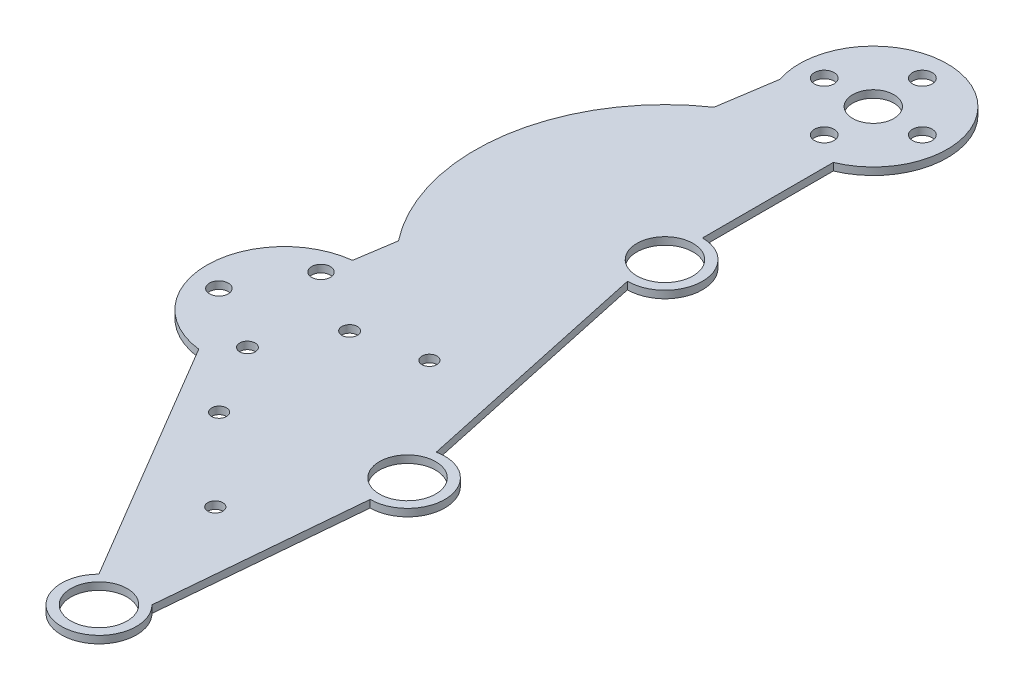
ISO-10303-21;
HEADER;
FILE_DESCRIPTION(('STEP AP214'),'2;1');
FILE_NAME('part.step','',(''),(''),'','','');
FILE_SCHEMA(('AUTOMOTIVE_DESIGN { 1 0 10303 214 1 1 1 1 }'));
ENDSEC;
DATA;
#1=APPLICATION_CONTEXT('core data for automotive mechanical design processes');
#2=APPLICATION_PROTOCOL_DEFINITION('international standard','automotive_design',2000,#1);
#3=PRODUCT_CONTEXT('',#1,'mechanical');
#4=PRODUCT('Part','Part','',(#3));
#5=PRODUCT_RELATED_PRODUCT_CATEGORY('part','',(#4));
#6=PRODUCT_DEFINITION_FORMATION('','',#4);
#7=PRODUCT_DEFINITION_CONTEXT('part definition',#1,'design');
#8=PRODUCT_DEFINITION('design','',#6,#7);
#9=PRODUCT_DEFINITION_SHAPE('','',#8);
#10=(LENGTH_UNIT() NAMED_UNIT(*) SI_UNIT(.MILLI.,.METRE.));
#11=(NAMED_UNIT(*) PLANE_ANGLE_UNIT() SI_UNIT($,.RADIAN.));
#12=(NAMED_UNIT(*) SI_UNIT($,.STERADIAN.) SOLID_ANGLE_UNIT());
#13=UNCERTAINTY_MEASURE_WITH_UNIT(LENGTH_MEASURE(1.E-05),#10,'distance_accuracy_value','');
#14=(GEOMETRIC_REPRESENTATION_CONTEXT(3) GLOBAL_UNCERTAINTY_ASSIGNED_CONTEXT((#13)) GLOBAL_UNIT_ASSIGNED_CONTEXT((#10,
#11,#12)) REPRESENTATION_CONTEXT('',''));
#15=CARTESIAN_POINT('',(0.,0.,0.));
#16=DIRECTION('',(0.,0.,1.));
#17=DIRECTION('',(1.,0.,0.));
#18=AXIS2_PLACEMENT_3D('',#15,#16,#17);
#19=CARTESIAN_POINT('',(46.6070895687635,1.5875,-56.1690373910345));
#20=DIRECTION('',(0.,-1.,0.));
#21=DIRECTION('',(0.,0.,-1.));
#22=AXIS2_PLACEMENT_3D('',#19,#20,#21);
#23=CYLINDRICAL_SURFACE('',#22,40.5);
#24=DIRECTION('',(0.,1.,0.));
#25=VECTOR('',#24,1.);
#26=CARTESIAN_POINT('',(14.718034312237,0.,-31.202296417367));
#27=LINE('',#26,#25);
#28=CARTESIAN_POINT('',(14.7180343122371,0.,-31.202296417367));
#29=VERTEX_POINT('',#28);
#30=CARTESIAN_POINT('',(14.7180343122371,1.5875,-31.202296417367));
#31=VERTEX_POINT('',#30);
#32=EDGE_CURVE('E50',#29,#31,#27,.T.);
#33=ORIENTED_EDGE('',*,*,#32,.T.);
#34=CARTESIAN_POINT('',(46.6070895687635,1.5875,-56.1690373910345));
#35=DIRECTION('',(0.,1.,0.));
#36=DIRECTION('',(0.,0.,1.));
#37=AXIS2_PLACEMENT_3D('',#34,#35,#36);
#38=CIRCLE('',#37,40.5);
#39=CARTESIAN_POINT('',(23.6849575190919,1.5875,-89.5580454969578));
#40=VERTEX_POINT('',#39);
#41=EDGE_CURVE('E188',#40,#31,#38,.T.);
#42=ORIENTED_EDGE('',*,*,#41,.F.);
#43=DIRECTION('',(0.,1.,0.));
#44=VECTOR('',#43,1.);
#45=CARTESIAN_POINT('',(23.6849575190919,0.,-89.5580454969578));
#46=LINE('',#45,#44);
#47=CARTESIAN_POINT('',(23.6849575190919,0.,-89.5580454969578));
#48=VERTEX_POINT('',#47);
#49=EDGE_CURVE('E139',#48,#40,#46,.T.);
#50=ORIENTED_EDGE('',*,*,#49,.F.);
#51=CARTESIAN_POINT('',(46.6070895687635,0.,-56.1690373910345));
#52=DIRECTION('',(0.,1.,0.));
#53=DIRECTION('',(0.,0.,1.));
#54=AXIS2_PLACEMENT_3D('',#51,#52,#53);
#55=CIRCLE('',#54,40.5);
#56=EDGE_CURVE('E55',#48,#29,#55,.T.);
#57=ORIENTED_EDGE('',*,*,#56,.T.);
#58=EDGE_LOOP('',(#33,#42,#50,#57));
#59=FACE_BOUND('',#58,.T.);
#60=ADVANCED_FACE('F35',(#59),#23,.T.);
#61=CARTESIAN_POINT('',(15.2467560354123,1.5875,-6.3076485631824));
#62=DIRECTION('',(0.,-1.,0.));
#63=DIRECTION('',(0.,0.,-1.));
#64=AXIS2_PLACEMENT_3D('',#61,#62,#63);
#65=CYLINDRICAL_SURFACE('',#64,16.5);
#66=CARTESIAN_POINT('',(15.2467560354123,0.,-6.3076485631824));
#67=DIRECTION('',(0.,1.,0.));
#68=DIRECTION('',(0.,0.,1.));
#69=AXIS2_PLACEMENT_3D('',#66,#67,#68);
#70=CIRCLE('',#69,16.5);
#71=CARTESIAN_POINT('',(13.4123990582158,0.,-22.7053659189673));
#72=VERTEX_POINT('',#71);
#73=CARTESIAN_POINT('',(13.4123990582158,0.,10.0900687926025));
#74=VERTEX_POINT('',#73);
#75=EDGE_CURVE('E124',#72,#74,#70,.T.);
#76=ORIENTED_EDGE('',*,*,#75,.T.);
#77=DIRECTION('',(0.,-1.,0.));
#78=VECTOR('',#77,1.);
#79=CARTESIAN_POINT('',(13.4123990582158,1.5875,10.0900687926025));
#80=LINE('',#79,#78);
#81=CARTESIAN_POINT('',(13.4123990582158,1.5875,10.0900687926025));
#82=VERTEX_POINT('',#81);
#83=EDGE_CURVE('E43',#82,#74,#80,.T.);
#84=ORIENTED_EDGE('',*,*,#83,.F.);
#85=CARTESIAN_POINT('',(15.2467560354123,1.5875,-6.3076485631824));
#86=DIRECTION('',(0.,1.,0.));
#87=DIRECTION('',(0.,0.,1.));
#88=AXIS2_PLACEMENT_3D('',#85,#86,#87);
#89=CIRCLE('',#88,16.5);
#90=CARTESIAN_POINT('',(13.4123990582158,1.5875,-22.7053659189673));
#91=VERTEX_POINT('',#90);
#92=EDGE_CURVE('E126',#91,#82,#89,.T.);
#93=ORIENTED_EDGE('',*,*,#92,.F.);
#94=DIRECTION('',(0.,-1.,0.));
#95=VECTOR('',#94,1.);
#96=CARTESIAN_POINT('',(13.4123990582158,1.5875,-22.7053659189673));
#97=LINE('',#96,#95);
#98=EDGE_CURVE('E11',#91,#72,#97,.T.);
#99=ORIENTED_EDGE('',*,*,#98,.T.);
#100=EDGE_LOOP('',(#76,#84,#93,#99));
#101=FACE_BOUND('',#100,.T.);
#102=ADVANCED_FACE('F37',(#101),#65,.T.);
#103=CARTESIAN_POINT('',(5.50767378532565,1.5875,-3.26092853556648));
#104=DIRECTION('',(-0.860488683472066,0.,0.509469553179099));
#105=DIRECTION('',(0.509469553179099,0.,0.860488683472066));
#106=AXIS2_PLACEMENT_3D('',#103,#104,#105);
#107=PLANE('',#106);
#108=DIRECTION('',(-0.509469553179099,0.,-0.860488683472066));
#109=VECTOR('',#108,1.);
#110=CARTESIAN_POINT('',(5.50767378532565,0.,-3.26092853556648));
#111=LINE('',#110,#109);
#112=CARTESIAN_POINT('',(44.3338284604601,0.,62.3160358035458));
#113=VERTEX_POINT('',#112);
#114=EDGE_CURVE('E138',#113,#74,#111,.T.);
#115=ORIENTED_EDGE('',*,*,#114,.F.);
#116=DIRECTION('',(0.,-1.,0.));
#117=VECTOR('',#116,1.);
#118=CARTESIAN_POINT('',(44.3338284604601,1.5875,62.3160358035458));
#119=LINE('',#118,#117);
#120=CARTESIAN_POINT('',(44.3338284604601,1.5875,62.3160358035458));
#121=VERTEX_POINT('',#120);
#122=EDGE_CURVE('E279',#121,#113,#119,.T.);
#123=ORIENTED_EDGE('',*,*,#122,.F.);
#124=DIRECTION('',(-0.509469553179099,0.,-0.860488683472066));
#125=VECTOR('',#124,1.);
#126=CARTESIAN_POINT('',(5.50767378532565,1.5875,-3.26092853556648));
#127=LINE('',#126,#125);
#128=EDGE_CURVE('E169',#121,#82,#127,.T.);
#129=ORIENTED_EDGE('',*,*,#128,.T.);
#130=ORIENTED_EDGE('',*,*,#83,.T.);
#131=EDGE_LOOP('',(#115,#123,#129,#130));
#132=FACE_BOUND('',#131,.T.);
#133=ADVANCED_FACE('F281',(#132),#107,.T.);
#134=CARTESIAN_POINT('',(50.,1.5875,67.9635573913317));
#135=DIRECTION('',(0.,-1.,0.));
#136=DIRECTION('',(0.,0.,-1.));
#137=AXIS2_PLACEMENT_3D('',#134,#135,#136);
#138=CYLINDRICAL_SURFACE('',#137,8.);
#139=CARTESIAN_POINT('',(50.,0.,67.9635573913317));
#140=DIRECTION('',(0.,1.,0.));
#141=DIRECTION('',(0.,0.,1.));
#142=AXIS2_PLACEMENT_3D('',#139,#140,#141);
#143=CIRCLE('',#142,8.);
#144=CARTESIAN_POINT('',(55.6661715395399,0.,62.3160358035458));
#145=VERTEX_POINT('',#144);
#146=EDGE_CURVE('E222',#113,#145,#143,.T.);
#147=ORIENTED_EDGE('',*,*,#146,.T.);
#148=DIRECTION('',(0.,-1.,0.));
#149=VECTOR('',#148,1.);
#150=CARTESIAN_POINT('',(55.6661715395399,1.5875,62.3160358035458));
#151=LINE('',#150,#149);
#152=CARTESIAN_POINT('',(55.6661715395399,1.5875,62.3160358035458));
#153=VERTEX_POINT('',#152);
#154=EDGE_CURVE('E277',#153,#145,#151,.T.);
#155=ORIENTED_EDGE('',*,*,#154,.F.);
#156=CARTESIAN_POINT('',(50.,1.5875,67.9635573913317));
#157=DIRECTION('',(0.,1.,0.));
#158=DIRECTION('',(0.,0.,1.));
#159=AXIS2_PLACEMENT_3D('',#156,#157,#158);
#160=CIRCLE('',#159,8.);
#161=EDGE_CURVE('E173',#121,#153,#160,.T.);
#162=ORIENTED_EDGE('',*,*,#161,.F.);
#163=ORIENTED_EDGE('',*,*,#122,.T.);
#164=EDGE_LOOP('',(#147,#155,#162,#163));
#165=FACE_BOUND('',#164,.T.);
#166=ADVANCED_FACE('F319',(#165),#138,.T.);
#167=CARTESIAN_POINT('',(60.7229238506235,1.5875,5.3944526583946));
#168=DIRECTION('',(0.996077182757255,0.,0.0884886771873701));
#169=DIRECTION('',(0.0884886771873701,0.,-0.996077182757255));
#170=AXIS2_PLACEMENT_3D('',#167,#168,#169);
#171=PLANE('',#170);
#172=DIRECTION('',(-0.0884886771873701,0.,0.996077182757255));
#173=VECTOR('',#172,1.);
#174=CARTESIAN_POINT('',(60.7229238506235,0.,5.3944526583946));
#175=LINE('',#174,#173);
#176=CARTESIAN_POINT('',(59.4628165552063,0.,19.5789129157589));
#177=VERTEX_POINT('',#176);
#178=EDGE_CURVE('E225',#177,#145,#175,.T.);
#179=ORIENTED_EDGE('',*,*,#178,.F.);
#180=DIRECTION('',(0.,-1.,0.));
#181=VECTOR('',#180,1.);
#182=CARTESIAN_POINT('',(59.4628165552063,1.5875,19.5789129157589));
#183=LINE('',#182,#181);
#184=CARTESIAN_POINT('',(59.4628165552063,1.5875,19.5789129157589));
#185=VERTEX_POINT('',#184);
#186=EDGE_CURVE('E275',#185,#177,#183,.T.);
#187=ORIENTED_EDGE('',*,*,#186,.F.);
#188=DIRECTION('',(-0.0884886771873701,0.,0.996077182757255));
#189=VECTOR('',#188,1.);
#190=CARTESIAN_POINT('',(60.7229238506235,1.5875,5.3944526583946));
#191=LINE('',#190,#189);
#192=EDGE_CURVE('E175',#185,#153,#191,.T.);
#193=ORIENTED_EDGE('',*,*,#192,.T.);
#194=ORIENTED_EDGE('',*,*,#154,.T.);
#195=EDGE_LOOP('',(#179,#187,#193,#194));
#196=FACE_BOUND('',#195,.T.);
#197=ADVANCED_FACE('F317',(#196),#171,.T.);
#198=CARTESIAN_POINT('',(59.4628165552063,1.5875,11.6024218204216));
#199=DIRECTION('',(0.,-1.,0.));
#200=DIRECTION('',(0.,0.,-1.));
#201=AXIS2_PLACEMENT_3D('',#198,#199,#200);
#202=CYLINDRICAL_SURFACE('',#201,7.97649109533736);
#203=CARTESIAN_POINT('',(59.4628165552063,0.,11.6024218204216));
#204=DIRECTION('',(0.,1.,0.));
#205=DIRECTION('',(0.,0.,1.));
#206=AXIS2_PLACEMENT_3D('',#203,#204,#205);
#207=CIRCLE('',#206,7.97649109533736);
#208=CARTESIAN_POINT('',(57.7855779211624,0.,3.80426301475039));
#209=VERTEX_POINT('',#208);
#210=EDGE_CURVE('E228',#177,#209,#207,.T.);
#211=ORIENTED_EDGE('',*,*,#210,.T.);
#212=DIRECTION('',(0.,-1.,0.));
#213=VECTOR('',#212,1.);
#214=CARTESIAN_POINT('',(57.7855779211624,1.5875,3.80426301475039));
#215=LINE('',#214,#213);
#216=CARTESIAN_POINT('',(57.7855779211624,1.5875,3.80426301475039));
#217=VERTEX_POINT('',#216);
#218=EDGE_CURVE('E273',#217,#209,#215,.T.);
#219=ORIENTED_EDGE('',*,*,#218,.F.);
#220=CARTESIAN_POINT('',(59.4628165552063,1.5875,11.6024218204216));
#221=DIRECTION('',(0.,1.,0.));
#222=DIRECTION('',(0.,0.,1.));
#223=AXIS2_PLACEMENT_3D('',#220,#221,#222);
#224=CIRCLE('',#223,7.97649109533736);
#225=EDGE_CURVE('E178',#185,#217,#224,.T.);
#226=ORIENTED_EDGE('',*,*,#225,.F.);
#227=ORIENTED_EDGE('',*,*,#186,.T.);
#228=EDGE_LOOP('',(#211,#219,#226,#227));
#229=FACE_BOUND('',#228,.T.);
#230=ADVANCED_FACE('F314',(#229),#202,.T.);
#231=CARTESIAN_POINT('',(54.4485617451196,1.5875,-11.7108709379738));
#232=DIRECTION('',(0.977642764527069,0.,-0.210272739478682));
#233=DIRECTION('',(-0.210272739478682,0.,-0.977642764527069));
#234=AXIS2_PLACEMENT_3D('',#231,#232,#233);
#235=PLANE('',#234);
#236=DIRECTION('',(0.210272739478682,0.,0.977642764527069));
#237=VECTOR('',#236,1.);
#238=CARTESIAN_POINT('',(54.4485617451196,0.,-11.7108709379738));
#239=LINE('',#238,#237);
#240=CARTESIAN_POINT('',(46.6070895687635,0.,-48.1690373910344));
#241=VERTEX_POINT('',#240);
#242=EDGE_CURVE('E231',#241,#209,#239,.T.);
#243=ORIENTED_EDGE('',*,*,#242,.F.);
#244=DIRECTION('',(0.,-1.,0.));
#245=VECTOR('',#244,1.);
#246=CARTESIAN_POINT('',(46.6070895687635,1.5875,-48.1690373910344));
#247=LINE('',#246,#245);
#248=CARTESIAN_POINT('',(46.6070895687635,1.5875,-48.1690373910344));
#249=VERTEX_POINT('',#248);
#250=EDGE_CURVE('E271',#249,#241,#247,.T.);
#251=ORIENTED_EDGE('',*,*,#250,.F.);
#252=DIRECTION('',(0.210272739478682,0.,0.977642764527069));
#253=VECTOR('',#252,1.);
#254=CARTESIAN_POINT('',(54.4485617451196,1.5875,-11.7108709379738));
#255=LINE('',#254,#253);
#256=EDGE_CURVE('E180',#249,#217,#255,.T.);
#257=ORIENTED_EDGE('',*,*,#256,.T.);
#258=ORIENTED_EDGE('',*,*,#218,.T.);
#259=EDGE_LOOP('',(#243,#251,#257,#258));
#260=FACE_BOUND('',#259,.T.);
#261=ADVANCED_FACE('F310',(#260),#235,.T.);
#262=CARTESIAN_POINT('',(46.6070895687635,1.5875,-56.1690373910345));
#263=DIRECTION('',(0.,-1.,0.));
#264=DIRECTION('',(0.,0.,-1.));
#265=AXIS2_PLACEMENT_3D('',#262,#263,#264);
#266=CYLINDRICAL_SURFACE('',#265,8.00000000000001);
#267=CARTESIAN_POINT('',(46.6070895687635,0.,-56.1690373910345));
#268=DIRECTION('',(0.,1.,0.));
#269=DIRECTION('',(0.,0.,1.));
#270=AXIS2_PLACEMENT_3D('',#267,#268,#269);
#271=CIRCLE('',#270,8.00000000000001);
#272=CARTESIAN_POINT('',(46.6070895687635,0.,-64.1690373910345));
#273=VERTEX_POINT('',#272);
#274=EDGE_CURVE('E234',#241,#273,#271,.T.);
#275=ORIENTED_EDGE('',*,*,#274,.T.);
#276=DIRECTION('',(0.,-1.,0.));
#277=VECTOR('',#276,1.);
#278=CARTESIAN_POINT('',(46.6070895687635,1.5875,-64.1690373910345));
#279=LINE('',#278,#277);
#280=CARTESIAN_POINT('',(46.6070895687635,1.5875,-64.1690373910345));
#281=VERTEX_POINT('',#280);
#282=EDGE_CURVE('E219',#281,#273,#279,.T.);
#283=ORIENTED_EDGE('',*,*,#282,.F.);
#284=CARTESIAN_POINT('',(46.6070895687635,1.5875,-56.1690373910345));
#285=DIRECTION('',(0.,1.,0.));
#286=DIRECTION('',(0.,0.,1.));
#287=AXIS2_PLACEMENT_3D('',#284,#285,#286);
#288=CIRCLE('',#287,8.00000000000001);
#289=EDGE_CURVE('E183',#249,#281,#288,.T.);
#290=ORIENTED_EDGE('',*,*,#289,.F.);
#291=ORIENTED_EDGE('',*,*,#250,.T.);
#292=EDGE_LOOP('',(#275,#283,#290,#291));
#293=FACE_BOUND('',#292,.T.);
#294=ADVANCED_FACE('F306',(#293),#266,.T.);
#295=CARTESIAN_POINT('',(46.6070895687635,1.5875,0.));
#296=DIRECTION('',(1.,0.,0.));
#297=DIRECTION('',(0.,0.,-1.));
#298=AXIS2_PLACEMENT_3D('',#295,#296,#297);
#299=PLANE('',#298);
#300=DIRECTION('',(0.,1.,0.));
#301=VECTOR('',#300,1.);
#302=CARTESIAN_POINT('',(46.6070895687635,0.,-92.0843608103368));
#303=LINE('',#302,#301);
#304=CARTESIAN_POINT('',(46.6070895687635,0.,-92.0843608103368));
#305=VERTEX_POINT('',#304);
#306=CARTESIAN_POINT('',(46.6070895687635,1.5875,-92.0843608103368));
#307=VERTEX_POINT('',#306);
#308=EDGE_CURVE('E158',#305,#307,#303,.T.);
#309=ORIENTED_EDGE('',*,*,#308,.T.);
#310=DIRECTION('',(0.,0.,1.));
#311=VECTOR('',#310,1.);
#312=CARTESIAN_POINT('',(46.6070895687635,1.5875,0.));
#313=LINE('',#312,#311);
#314=EDGE_CURVE('E186',#307,#281,#313,.T.);
#315=ORIENTED_EDGE('',*,*,#314,.T.);
#316=ORIENTED_EDGE('',*,*,#282,.T.);
#317=DIRECTION('',(0.,0.,1.));
#318=VECTOR('',#317,1.);
#319=CARTESIAN_POINT('',(46.6070895687635,0.,0.));
#320=LINE('',#319,#318);
#321=EDGE_CURVE('E237',#305,#273,#320,.T.);
#322=ORIENTED_EDGE('',*,*,#321,.F.);
#323=EDGE_LOOP('',(#309,#315,#316,#322));
#324=FACE_BOUND('',#323,.T.);
#325=ADVANCED_FACE('F301',(#324),#299,.T.);
#326=CARTESIAN_POINT('',(50.,1.5875,67.9635573913317));
#327=DIRECTION('',(0.,-1.,0.));
#328=DIRECTION('',(0.,0.,-1.));
#329=AXIS2_PLACEMENT_3D('',#326,#327,#328);
#330=CYLINDRICAL_SURFACE('',#329,5.99999999999999);
#331=CARTESIAN_POINT('',(50.,1.5875,67.9635573913317));
#332=DIRECTION('',(0.,1.,0.));
#333=DIRECTION('',(0.,0.,1.));
#334=AXIS2_PLACEMENT_3D('',#331,#332,#333);
#335=CIRCLE('',#334,5.99999999999999);
#336=CARTESIAN_POINT('',(50.,1.5875,73.9635573913317));
#337=VERTEX_POINT('',#336);
#338=EDGE_CURVE('E214',#337,#337,#335,.T.);
#339=ORIENTED_EDGE('',*,*,#338,.T.);
#340=EDGE_LOOP('',(#339));
#341=FACE_BOUND('',#340,.T.);
#342=CARTESIAN_POINT('',(50.,0.,67.9635573913317));
#343=DIRECTION('',(0.,1.,0.));
#344=DIRECTION('',(0.,0.,1.));
#345=AXIS2_PLACEMENT_3D('',#342,#343,#344);
#346=CIRCLE('',#345,5.99999999999999);
#347=CARTESIAN_POINT('',(50.,0.,73.9635573913317));
#348=VERTEX_POINT('',#347);
#349=EDGE_CURVE('E264',#348,#348,#346,.T.);
#350=ORIENTED_EDGE('',*,*,#349,.F.);
#351=EDGE_LOOP('',(#350));
#352=FACE_BOUND('',#351,.T.);
#353=ADVANCED_FACE('F338',(#341,#352),#330,.F.);
#354=CARTESIAN_POINT('',(59.4628165552063,1.5875,11.6024218204216));
#355=DIRECTION('',(0.,-1.,0.));
#356=DIRECTION('',(0.,0.,-1.));
#357=AXIS2_PLACEMENT_3D('',#354,#355,#356);
#358=CYLINDRICAL_SURFACE('',#357,5.99999999999999);
#359=CARTESIAN_POINT('',(59.4628165552063,1.5875,11.6024218204216));
#360=DIRECTION('',(0.,1.,0.));
#361=DIRECTION('',(0.,0.,1.));
#362=AXIS2_PLACEMENT_3D('',#359,#360,#361);
#363=CIRCLE('',#362,5.99999999999999);
#364=CARTESIAN_POINT('',(59.4628165552063,1.5875,17.6024218204216));
#365=VERTEX_POINT('',#364);
#366=EDGE_CURVE('E211',#365,#365,#363,.T.);
#367=ORIENTED_EDGE('',*,*,#366,.T.);
#368=EDGE_LOOP('',(#367));
#369=FACE_BOUND('',#368,.T.);
#370=CARTESIAN_POINT('',(59.4628165552063,0.,11.6024218204216));
#371=DIRECTION('',(0.,1.,0.));
#372=DIRECTION('',(0.,0.,1.));
#373=AXIS2_PLACEMENT_3D('',#370,#371,#372);
#374=CIRCLE('',#373,5.99999999999999);
#375=CARTESIAN_POINT('',(59.4628165552063,0.,17.6024218204216));
#376=VERTEX_POINT('',#375);
#377=EDGE_CURVE('E261',#376,#376,#374,.T.);
#378=ORIENTED_EDGE('',*,*,#377,.F.);
#379=EDGE_LOOP('',(#378));
#380=FACE_BOUND('',#379,.T.);
#381=ADVANCED_FACE('F368',(#369,#380),#358,.F.);
#382=CARTESIAN_POINT('',(44.3338284604601,1.5875,37.488387537969));
#383=DIRECTION('',(0.,-1.,0.));
#384=DIRECTION('',(0.,0.,-1.));
#385=AXIS2_PLACEMENT_3D('',#382,#383,#384);
#386=CYLINDRICAL_SURFACE('',#385,1.6);
#387=CARTESIAN_POINT('',(44.3338284604601,1.5875,37.488387537969));
#388=DIRECTION('',(0.,1.,0.));
#389=DIRECTION('',(0.,0.,1.));
#390=AXIS2_PLACEMENT_3D('',#387,#388,#389);
#391=CIRCLE('',#390,1.6);
#392=CARTESIAN_POINT('',(44.3338284604601,1.5875,39.088387537969));
#393=VERTEX_POINT('',#392);
#394=EDGE_CURVE('E208',#393,#393,#391,.T.);
#395=ORIENTED_EDGE('',*,*,#394,.T.);
#396=EDGE_LOOP('',(#395));
#397=FACE_BOUND('',#396,.T.);
#398=CARTESIAN_POINT('',(44.3338284604601,0.,37.488387537969));
#399=DIRECTION('',(0.,1.,0.));
#400=DIRECTION('',(0.,0.,1.));
#401=AXIS2_PLACEMENT_3D('',#398,#399,#400);
#402=CIRCLE('',#401,1.6);
#403=CARTESIAN_POINT('',(44.3338284604601,0.,39.088387537969));
#404=VERTEX_POINT('',#403);
#405=EDGE_CURVE('E258',#404,#404,#402,.T.);
#406=ORIENTED_EDGE('',*,*,#405,.F.);
#407=EDGE_LOOP('',(#406));
#408=FACE_BOUND('',#407,.T.);
#409=ADVANCED_FACE('F376',(#397,#408),#386,.F.);
#410=CARTESIAN_POINT('',(27.2332348020782,1.5875,19.5789129157589));
#411=DIRECTION('',(0.,-1.,0.));
#412=DIRECTION('',(0.,0.,-1.));
#413=AXIS2_PLACEMENT_3D('',#410,#411,#412);
#414=CYLINDRICAL_SURFACE('',#413,1.6);
#415=CARTESIAN_POINT('',(27.2332348020782,1.5875,19.5789129157589));
#416=DIRECTION('',(0.,1.,0.));
#417=DIRECTION('',(0.,0.,1.));
#418=AXIS2_PLACEMENT_3D('',#415,#416,#417);
#419=CIRCLE('',#418,1.6);
#420=CARTESIAN_POINT('',(27.2332348020782,1.5875,21.1789129157589));
#421=VERTEX_POINT('',#420);
#422=EDGE_CURVE('E205',#421,#421,#419,.T.);
#423=ORIENTED_EDGE('',*,*,#422,.T.);
#424=EDGE_LOOP('',(#423));
#425=FACE_BOUND('',#424,.T.);
#426=CARTESIAN_POINT('',(27.2332348020782,0.,19.5789129157589));
#427=DIRECTION('',(0.,1.,0.));
#428=DIRECTION('',(0.,0.,1.));
#429=AXIS2_PLACEMENT_3D('',#426,#427,#428);
#430=CIRCLE('',#429,1.6);
#431=CARTESIAN_POINT('',(27.2332348020782,0.,21.1789129157589));
#432=VERTEX_POINT('',#431);
#433=EDGE_CURVE('E255',#432,#432,#430,.T.);
#434=ORIENTED_EDGE('',*,*,#433,.F.);
#435=EDGE_LOOP('',(#434));
#436=FACE_BOUND('',#435,.T.);
#437=ADVANCED_FACE('F384',(#425,#436),#414,.F.);
#438=CARTESIAN_POINT('',(40.0896323605326,1.5875,-12.4397392271413));
#439=DIRECTION('',(0.,-1.,0.));
#440=DIRECTION('',(0.,0.,-1.));
#441=AXIS2_PLACEMENT_3D('',#438,#439,#440);
#442=CYLINDRICAL_SURFACE('',#441,1.6);
#443=CARTESIAN_POINT('',(40.0896323605326,1.5875,-12.4397392271413));
#444=DIRECTION('',(0.,1.,0.));
#445=DIRECTION('',(0.,0.,1.));
#446=AXIS2_PLACEMENT_3D('',#443,#444,#445);
#447=CIRCLE('',#446,1.6);
#448=CARTESIAN_POINT('',(40.0896323605326,1.5875,-10.8397392271413));
#449=VERTEX_POINT('',#448);
#450=EDGE_CURVE('E202',#449,#449,#447,.T.);
#451=ORIENTED_EDGE('',*,*,#450,.T.);
#452=EDGE_LOOP('',(#451));
#453=FACE_BOUND('',#452,.T.);
#454=CARTESIAN_POINT('',(40.0896323605326,0.,-12.4397392271413));
#455=DIRECTION('',(0.,1.,0.));
#456=DIRECTION('',(0.,0.,1.));
#457=AXIS2_PLACEMENT_3D('',#454,#455,#456);
#458=CIRCLE('',#457,1.6);
#459=CARTESIAN_POINT('',(40.0896323605326,0.,-10.8397392271413));
#460=VERTEX_POINT('',#459);
#461=EDGE_CURVE('E252',#460,#460,#458,.T.);
#462=ORIENTED_EDGE('',*,*,#461,.F.);
#463=EDGE_LOOP('',(#462));
#464=FACE_BOUND('',#463,.T.);
#465=ADVANCED_FACE('F392',(#453,#464),#442,.F.);
#466=CARTESIAN_POINT('',(18.2953883109802,1.5875,4.58757246486161));
#467=DIRECTION('',(0.,-1.,0.));
#468=DIRECTION('',(0.,0.,-1.));
#469=AXIS2_PLACEMENT_3D('',#466,#467,#468);
#470=CYLINDRICAL_SURFACE('',#469,1.64999999992464);
#471=CARTESIAN_POINT('',(18.2953883109802,1.5875,4.58757246486161));
#472=DIRECTION('',(0.,1.,0.));
#473=DIRECTION('',(0.,0.,1.));
#474=AXIS2_PLACEMENT_3D('',#471,#472,#473);
#475=CIRCLE('',#474,1.64999999992464);
#476=CARTESIAN_POINT('',(18.2953883109802,1.5875,6.23757246478625));
#477=VERTEX_POINT('',#476);
#478=EDGE_CURVE('E199',#477,#477,#475,.T.);
#479=ORIENTED_EDGE('',*,*,#478,.T.);
#480=EDGE_LOOP('',(#479));
#481=FACE_BOUND('',#480,.T.);
#482=CARTESIAN_POINT('',(18.2953883109802,0.,4.58757246486161));
#483=DIRECTION('',(0.,1.,0.));
#484=DIRECTION('',(0.,0.,1.));
#485=AXIS2_PLACEMENT_3D('',#482,#483,#484);
#486=CIRCLE('',#485,1.64999999992464);
#487=CARTESIAN_POINT('',(18.2953883109802,0.,6.23757246478625));
#488=VERTEX_POINT('',#487);
#489=EDGE_CURVE('E249',#488,#488,#486,.T.);
#490=ORIENTED_EDGE('',*,*,#489,.F.);
#491=EDGE_LOOP('',(#490));
#492=FACE_BOUND('',#491,.T.);
#493=ADVANCED_FACE('F400',(#481,#492),#470,.F.);
#494=CARTESIAN_POINT('',(26.1419770634101,1.5875,-9.35628083865896));
#495=DIRECTION('',(0.,-1.,0.));
#496=DIRECTION('',(0.,0.,-1.));
#497=AXIS2_PLACEMENT_3D('',#494,#495,#496);
#498=CYLINDRICAL_SURFACE('',#497,1.64999999998933);
#499=CARTESIAN_POINT('',(26.1419770634101,1.5875,-9.35628083865896));
#500=DIRECTION('',(0.,1.,0.));
#501=DIRECTION('',(0.,0.,1.));
#502=AXIS2_PLACEMENT_3D('',#499,#500,#501);
#503=CIRCLE('',#502,1.64999999998933);
#504=CARTESIAN_POINT('',(26.1419770634101,1.5875,-7.70628083866963));
#505=VERTEX_POINT('',#504);
#506=EDGE_CURVE('E196',#505,#505,#503,.T.);
#507=ORIENTED_EDGE('',*,*,#506,.T.);
#508=EDGE_LOOP('',(#507));
#509=FACE_BOUND('',#508,.T.);
#510=CARTESIAN_POINT('',(26.1419770634101,0.,-9.35628083865896));
#511=DIRECTION('',(0.,1.,0.));
#512=DIRECTION('',(0.,0.,1.));
#513=AXIS2_PLACEMENT_3D('',#510,#511,#512);
#514=CIRCLE('',#513,1.64999999998933);
#515=CARTESIAN_POINT('',(26.1419770634101,0.,-7.70628083866963));
#516=VERTEX_POINT('',#515);
#517=EDGE_CURVE('E246',#516,#516,#514,.T.);
#518=ORIENTED_EDGE('',*,*,#517,.F.);
#519=EDGE_LOOP('',(#518));
#520=FACE_BOUND('',#519,.T.);
#521=ADVANCED_FACE('F408',(#509,#520),#498,.F.);
#522=CARTESIAN_POINT('',(12.1981237599358,1.5875,-17.2028695911802));
#523=DIRECTION('',(0.,-1.,0.));
#524=DIRECTION('',(0.,0.,-1.));
#525=AXIS2_PLACEMENT_3D('',#522,#523,#524);
#526=CYLINDRICAL_SURFACE('',#525,2.00000000000005);
#527=CARTESIAN_POINT('',(12.1981237599358,1.5875,-17.2028695911802));
#528=DIRECTION('',(0.,1.,0.));
#529=DIRECTION('',(0.,0.,1.));
#530=AXIS2_PLACEMENT_3D('',#527,#528,#529);
#531=CIRCLE('',#530,2.00000000000005);
#532=CARTESIAN_POINT('',(12.1981237599358,1.5875,-15.2028695911802));
#533=VERTEX_POINT('',#532);
#534=EDGE_CURVE('E193',#533,#533,#531,.T.);
#535=ORIENTED_EDGE('',*,*,#534,.T.);
#536=EDGE_LOOP('',(#535));
#537=FACE_BOUND('',#536,.T.);
#538=CARTESIAN_POINT('',(12.1981237599358,0.,-17.2028695911802));
#539=DIRECTION('',(0.,1.,0.));
#540=DIRECTION('',(0.,0.,1.));
#541=AXIS2_PLACEMENT_3D('',#538,#539,#540);
#542=CIRCLE('',#541,2.00000000000005);
#543=CARTESIAN_POINT('',(12.1981237599358,0.,-15.2028695911802));
#544=VERTEX_POINT('',#543);
#545=EDGE_CURVE('E243',#544,#544,#542,.T.);
#546=ORIENTED_EDGE('',*,*,#545,.F.);
#547=EDGE_LOOP('',(#546));
#548=FACE_BOUND('',#547,.T.);
#549=ADVANCED_FACE('F416',(#537,#548),#526,.F.);
#550=CARTESIAN_POINT('',(4.3515350074147,1.5875,-3.25901628770601));
#551=DIRECTION('',(0.,-1.,0.));
#552=DIRECTION('',(0.,0.,-1.));
#553=AXIS2_PLACEMENT_3D('',#550,#551,#552);
#554=CYLINDRICAL_SURFACE('',#553,1.99999999998247);
#555=CARTESIAN_POINT('',(4.3515350074147,1.5875,-3.25901628770601));
#556=DIRECTION('',(0.,1.,0.));
#557=DIRECTION('',(0.,0.,1.));
#558=AXIS2_PLACEMENT_3D('',#555,#556,#557);
#559=CIRCLE('',#558,1.99999999998247);
#560=CARTESIAN_POINT('',(4.3515350074147,1.5875,-1.25901628772355));
#561=VERTEX_POINT('',#560);
#562=EDGE_CURVE('E190',#561,#561,#559,.T.);
#563=ORIENTED_EDGE('',*,*,#562,.T.);
#564=EDGE_LOOP('',(#563));
#565=FACE_BOUND('',#564,.T.);
#566=CARTESIAN_POINT('',(4.3515350074147,0.,-3.25901628770601));
#567=DIRECTION('',(0.,1.,0.));
#568=DIRECTION('',(0.,0.,1.));
#569=AXIS2_PLACEMENT_3D('',#566,#567,#568);
#570=CIRCLE('',#569,1.99999999998247);
#571=CARTESIAN_POINT('',(4.3515350074147,0.,-1.25901628772355));
#572=VERTEX_POINT('',#571);
#573=EDGE_CURVE('E240',#572,#572,#570,.T.);
#574=ORIENTED_EDGE('',*,*,#573,.F.);
#575=EDGE_LOOP('',(#574));
#576=FACE_BOUND('',#575,.T.);
#577=ADVANCED_FACE('F334',(#565,#576),#554,.F.);
#578=CARTESIAN_POINT('',(46.6070895687635,1.5875,-56.1690373910345));
#579=DIRECTION('',(0.,-1.,0.));
#580=DIRECTION('',(0.,0.,-1.));
#581=AXIS2_PLACEMENT_3D('',#578,#579,#580);
#582=CYLINDRICAL_SURFACE('',#581,6.00000000000001);
#583=CARTESIAN_POINT('',(46.6070895687635,1.5875,-56.1690373910345));
#584=DIRECTION('',(0.,1.,0.));
#585=DIRECTION('',(0.,0.,1.));
#586=AXIS2_PLACEMENT_3D('',#583,#584,#585);
#587=CIRCLE('',#586,6.00000000000001);
#588=CARTESIAN_POINT('',(46.6070895687635,1.5875,-50.1690373910344));
#589=VERTEX_POINT('',#588);
#590=EDGE_CURVE('E217',#589,#589,#587,.T.);
#591=ORIENTED_EDGE('',*,*,#590,.T.);
#592=EDGE_LOOP('',(#591));
#593=FACE_BOUND('',#592,.T.);
#594=CARTESIAN_POINT('',(46.6070895687635,0.,-56.1690373910345));
#595=DIRECTION('',(0.,1.,0.));
#596=DIRECTION('',(0.,0.,1.));
#597=AXIS2_PLACEMENT_3D('',#594,#595,#596);
#598=CIRCLE('',#597,6.00000000000001);
#599=CARTESIAN_POINT('',(46.6070895687635,0.,-50.1690373910344));
#600=VERTEX_POINT('',#599);
#601=EDGE_CURVE('E170',#600,#600,#598,.T.);
#602=ORIENTED_EDGE('',*,*,#601,.F.);
#603=EDGE_LOOP('',(#602));
#604=FACE_BOUND('',#603,.T.);
#605=ADVANCED_FACE('F430',(#593,#604),#582,.F.);
#606=CARTESIAN_POINT('',(0.,1.5875,0.));
#607=DIRECTION('',(0.,1.,0.));
#608=DIRECTION('',(0.,0.,1.));
#609=AXIS2_PLACEMENT_3D('',#606,#607,#608);
#610=PLANE('',#609);
#611=CARTESIAN_POINT('',(40.5462576271199,1.5875,-117.140249610408));
#612=DIRECTION('',(0.,1.,0.));
#613=DIRECTION('',(0.,0.,1.));
#614=AXIS2_PLACEMENT_3D('',#611,#612,#613);
#615=CIRCLE('',#614,2.1);
#616=CARTESIAN_POINT('',(40.5462576271199,1.5875,-115.040249610408));
#617=VERTEX_POINT('',#616);
#618=EDGE_CURVE('E653',#617,#617,#615,.T.);
#619=ORIENTED_EDGE('',*,*,#618,.F.);
#620=EDGE_LOOP('',(#619));
#621=FACE_BOUND('',#620,.T.);
#622=CARTESIAN_POINT('',(40.5462576271199,1.5875,-96.2049833963191));
#623=DIRECTION('',(0.,1.,0.));
#624=DIRECTION('',(0.,0.,1.));
#625=AXIS2_PLACEMENT_3D('',#622,#623,#624);
#626=CIRCLE('',#625,2.1);
#627=CARTESIAN_POINT('',(40.5462576271199,1.5875,-94.1049833963191));
#628=VERTEX_POINT('',#627);
#629=EDGE_CURVE('E670',#628,#628,#626,.T.);
#630=ORIENTED_EDGE('',*,*,#629,.F.);
#631=EDGE_LOOP('',(#630));
#632=FACE_BOUND('',#631,.T.);
#633=CARTESIAN_POINT('',(40.5462576271199,1.5875,-106.672616503364));
#634=DIRECTION('',(0.,1.,0.));
#635=DIRECTION('',(0.,0.,1.));
#636=AXIS2_PLACEMENT_3D('',#633,#634,#635);
#637=CIRCLE('',#636,4.4);
#638=CARTESIAN_POINT('',(40.5462576271199,1.5875,-102.272616503364));
#639=VERTEX_POINT('',#638);
#640=EDGE_CURVE('E664',#639,#639,#637,.T.);
#641=ORIENTED_EDGE('',*,*,#640,.F.);
#642=EDGE_LOOP('',(#641));
#643=FACE_BOUND('',#642,.T.);
#644=CARTESIAN_POINT('',(51.0138907341644,1.5875,-106.672616503364));
#645=DIRECTION('',(0.,1.,0.));
#646=DIRECTION('',(0.,0.,1.));
#647=AXIS2_PLACEMENT_3D('',#644,#645,#646);
#648=CIRCLE('',#647,2.1);
#649=CARTESIAN_POINT('',(51.0138907341644,1.5875,-104.572616503364));
#650=VERTEX_POINT('',#649);
#651=EDGE_CURVE('E149',#650,#650,#648,.T.);
#652=ORIENTED_EDGE('',*,*,#651,.F.);
#653=EDGE_LOOP('',(#652));
#654=FACE_BOUND('',#653,.T.);
#655=CARTESIAN_POINT('',(30.0786245200755,1.5875,-106.672616503364));
#656=DIRECTION('',(0.,1.,0.));
#657=DIRECTION('',(0.,0.,1.));
#658=AXIS2_PLACEMENT_3D('',#655,#656,#657);
#659=CIRCLE('',#658,2.1);
#660=CARTESIAN_POINT('',(30.0786245200755,1.5875,-104.572616503364));
#661=VERTEX_POINT('',#660);
#662=EDGE_CURVE('E658',#661,#661,#659,.T.);
#663=ORIENTED_EDGE('',*,*,#662,.F.);
#664=EDGE_LOOP('',(#663));
#665=FACE_BOUND('',#664,.T.);
#666=ORIENTED_EDGE('',*,*,#314,.F.);
#667=CARTESIAN_POINT('',(40.5462576271199,1.5875,-106.672616503364));
#668=DIRECTION('',(0.,1.,0.));
#669=DIRECTION('',(0.,0.,1.));
#670=AXIS2_PLACEMENT_3D('',#667,#668,#669);
#671=CIRCLE('',#670,15.7971797479795);
#672=CARTESIAN_POINT('',(25.5511420467442,1.5875,-101.702968958401));
#673=VERTEX_POINT('',#672);
#674=EDGE_CURVE('E144',#307,#673,#671,.T.);
#675=ORIENTED_EDGE('',*,*,#674,.T.);
#676=DIRECTION('',(0.151877090868865,0.,-0.988399387529763));
#677=VECTOR('',#676,1.);
#678=CARTESIAN_POINT('',(9.69459885195523,1.5875,1.48966853819632));
#679=LINE('',#678,#677);
#680=EDGE_CURVE('E156',#40,#673,#679,.T.);
#681=ORIENTED_EDGE('',*,*,#680,.F.);
#682=ORIENTED_EDGE('',*,*,#41,.T.);
#683=DIRECTION('',(0.151877090868865,0.,-0.988399387529763));
#684=VECTOR('',#683,1.);
#685=CARTESIAN_POINT('',(9.69459885195523,1.5875,1.48966853819632));
#686=LINE('',#685,#684);
#687=EDGE_CURVE('E142',#91,#31,#686,.T.);
#688=ORIENTED_EDGE('',*,*,#687,.F.);
#689=ORIENTED_EDGE('',*,*,#92,.T.);
#690=ORIENTED_EDGE('',*,*,#128,.F.);
#691=ORIENTED_EDGE('',*,*,#161,.T.);
#692=ORIENTED_EDGE('',*,*,#192,.F.);
#693=ORIENTED_EDGE('',*,*,#225,.T.);
#694=ORIENTED_EDGE('',*,*,#256,.F.);
#695=ORIENTED_EDGE('',*,*,#289,.T.);
#696=EDGE_LOOP('',(#666,#675,#681,#682,#688,#689,#690,#691,#692,#693,#694,#695));
#697=FACE_BOUND('',#696,.T.);
#698=ORIENTED_EDGE('',*,*,#562,.F.);
#699=EDGE_LOOP('',(#698));
#700=FACE_BOUND('',#699,.T.);
#701=ORIENTED_EDGE('',*,*,#534,.F.);
#702=EDGE_LOOP('',(#701));
#703=FACE_BOUND('',#702,.T.);
#704=ORIENTED_EDGE('',*,*,#506,.F.);
#705=EDGE_LOOP('',(#704));
#706=FACE_BOUND('',#705,.T.);
#707=ORIENTED_EDGE('',*,*,#478,.F.);
#708=EDGE_LOOP('',(#707));
#709=FACE_BOUND('',#708,.T.);
#710=ORIENTED_EDGE('',*,*,#450,.F.);
#711=EDGE_LOOP('',(#710));
#712=FACE_BOUND('',#711,.T.);
#713=ORIENTED_EDGE('',*,*,#422,.F.);
#714=EDGE_LOOP('',(#713));
#715=FACE_BOUND('',#714,.T.);
#716=ORIENTED_EDGE('',*,*,#394,.F.);
#717=EDGE_LOOP('',(#716));
#718=FACE_BOUND('',#717,.T.);
#719=ORIENTED_EDGE('',*,*,#366,.F.);
#720=EDGE_LOOP('',(#719));
#721=FACE_BOUND('',#720,.T.);
#722=ORIENTED_EDGE('',*,*,#338,.F.);
#723=EDGE_LOOP('',(#722));
#724=FACE_BOUND('',#723,.T.);
#725=ORIENTED_EDGE('',*,*,#590,.F.);
#726=EDGE_LOOP('',(#725));
#727=FACE_BOUND('',#726,.T.);
#728=ADVANCED_FACE('F286',(#621,#632,#643,#654,#665,#697,#700,#703,#706,#709,#712,#715,#718,
#721,#724,#727),#610,.T.);
#729=CARTESIAN_POINT('',(0.,0.,0.));
#730=DIRECTION('',(0.,1.,0.));
#731=DIRECTION('',(0.,0.,1.));
#732=AXIS2_PLACEMENT_3D('',#729,#730,#731);
#733=PLANE('',#732);
#734=CARTESIAN_POINT('',(40.5462576271199,0.,-117.140249610408));
#735=DIRECTION('',(0.,1.,0.));
#736=DIRECTION('',(0.,0.,1.));
#737=AXIS2_PLACEMENT_3D('',#734,#735,#736);
#738=CIRCLE('',#737,2.1);
#739=CARTESIAN_POINT('',(40.5462576271199,0.,-115.040249610408));
#740=VERTEX_POINT('',#739);
#741=EDGE_CURVE('E146',#740,#740,#738,.T.);
#742=ORIENTED_EDGE('',*,*,#741,.T.);
#743=EDGE_LOOP('',(#742));
#744=FACE_BOUND('',#743,.T.);
#745=CARTESIAN_POINT('',(40.5462576271199,0.,-96.2049833963191));
#746=DIRECTION('',(0.,1.,0.));
#747=DIRECTION('',(0.,0.,1.));
#748=AXIS2_PLACEMENT_3D('',#745,#746,#747);
#749=CIRCLE('',#748,2.1);
#750=CARTESIAN_POINT('',(40.5462576271199,0.,-94.1049833963191));
#751=VERTEX_POINT('',#750);
#752=EDGE_CURVE('E667',#751,#751,#749,.T.);
#753=ORIENTED_EDGE('',*,*,#752,.T.);
#754=EDGE_LOOP('',(#753));
#755=FACE_BOUND('',#754,.T.);
#756=CARTESIAN_POINT('',(40.5462576271199,0.,-106.672616503364));
#757=DIRECTION('',(0.,1.,0.));
#758=DIRECTION('',(0.,0.,1.));
#759=AXIS2_PLACEMENT_3D('',#756,#757,#758);
#760=CIRCLE('',#759,4.4);
#761=CARTESIAN_POINT('',(40.5462576271199,0.,-102.272616503364));
#762=VERTEX_POINT('',#761);
#763=EDGE_CURVE('E661',#762,#762,#760,.T.);
#764=ORIENTED_EDGE('',*,*,#763,.T.);
#765=EDGE_LOOP('',(#764));
#766=FACE_BOUND('',#765,.T.);
#767=CARTESIAN_POINT('',(51.0138907341644,0.,-106.672616503364));
#768=DIRECTION('',(0.,1.,0.));
#769=DIRECTION('',(0.,0.,1.));
#770=AXIS2_PLACEMENT_3D('',#767,#768,#769);
#771=CIRCLE('',#770,2.1);
#772=CARTESIAN_POINT('',(51.0138907341644,0.,-104.572616503364));
#773=VERTEX_POINT('',#772);
#774=EDGE_CURVE('E674',#773,#773,#771,.T.);
#775=ORIENTED_EDGE('',*,*,#774,.T.);
#776=EDGE_LOOP('',(#775));
#777=FACE_BOUND('',#776,.T.);
#778=CARTESIAN_POINT('',(30.0786245200755,0.,-106.672616503364));
#779=DIRECTION('',(0.,1.,0.));
#780=DIRECTION('',(0.,0.,1.));
#781=AXIS2_PLACEMENT_3D('',#778,#779,#780);
#782=CIRCLE('',#781,2.1);
#783=CARTESIAN_POINT('',(30.0786245200755,0.,-104.572616503364));
#784=VERTEX_POINT('',#783);
#785=EDGE_CURVE('E654',#784,#784,#782,.T.);
#786=ORIENTED_EDGE('',*,*,#785,.T.);
#787=EDGE_LOOP('',(#786));
#788=FACE_BOUND('',#787,.T.);
#789=CARTESIAN_POINT('',(40.5462576271199,0.,-106.672616503364));
#790=DIRECTION('',(0.,1.,0.));
#791=DIRECTION('',(0.,0.,1.));
#792=AXIS2_PLACEMENT_3D('',#789,#790,#791);
#793=CIRCLE('',#792,15.7971797479795);
#794=CARTESIAN_POINT('',(25.5511420467442,0.,-101.702968958401));
#795=VERTEX_POINT('',#794);
#796=EDGE_CURVE('E152',#305,#795,#793,.T.);
#797=ORIENTED_EDGE('',*,*,#796,.F.);
#798=ORIENTED_EDGE('',*,*,#321,.T.);
#799=ORIENTED_EDGE('',*,*,#274,.F.);
#800=ORIENTED_EDGE('',*,*,#242,.T.);
#801=ORIENTED_EDGE('',*,*,#210,.F.);
#802=ORIENTED_EDGE('',*,*,#178,.T.);
#803=ORIENTED_EDGE('',*,*,#146,.F.);
#804=ORIENTED_EDGE('',*,*,#114,.T.);
#805=ORIENTED_EDGE('',*,*,#75,.F.);
#806=DIRECTION('',(0.151877090868865,0.,-0.988399387529763));
#807=VECTOR('',#806,1.);
#808=CARTESIAN_POINT('',(9.69459885195523,0.,1.48966853819632));
#809=LINE('',#808,#807);
#810=EDGE_CURVE('E135',#72,#29,#809,.T.);
#811=ORIENTED_EDGE('',*,*,#810,.T.);
#812=ORIENTED_EDGE('',*,*,#56,.F.);
#813=DIRECTION('',(0.151877090868865,0.,-0.988399387529763));
#814=VECTOR('',#813,1.);
#815=CARTESIAN_POINT('',(9.69459885195523,0.,1.48966853819632));
#816=LINE('',#815,#814);
#817=EDGE_CURVE('E155',#48,#795,#816,.T.);
#818=ORIENTED_EDGE('',*,*,#817,.T.);
#819=EDGE_LOOP('',(#797,#798,#799,#800,#801,#802,#803,#804,#805,#811,#812,#818));
#820=FACE_BOUND('',#819,.T.);
#821=ORIENTED_EDGE('',*,*,#573,.T.);
#822=EDGE_LOOP('',(#821));
#823=FACE_BOUND('',#822,.T.);
#824=ORIENTED_EDGE('',*,*,#545,.T.);
#825=EDGE_LOOP('',(#824));
#826=FACE_BOUND('',#825,.T.);
#827=ORIENTED_EDGE('',*,*,#517,.T.);
#828=EDGE_LOOP('',(#827));
#829=FACE_BOUND('',#828,.T.);
#830=ORIENTED_EDGE('',*,*,#489,.T.);
#831=EDGE_LOOP('',(#830));
#832=FACE_BOUND('',#831,.T.);
#833=ORIENTED_EDGE('',*,*,#461,.T.);
#834=EDGE_LOOP('',(#833));
#835=FACE_BOUND('',#834,.T.);
#836=ORIENTED_EDGE('',*,*,#433,.T.);
#837=EDGE_LOOP('',(#836));
#838=FACE_BOUND('',#837,.T.);
#839=ORIENTED_EDGE('',*,*,#405,.T.);
#840=EDGE_LOOP('',(#839));
#841=FACE_BOUND('',#840,.T.);
#842=ORIENTED_EDGE('',*,*,#377,.T.);
#843=EDGE_LOOP('',(#842));
#844=FACE_BOUND('',#843,.T.);
#845=ORIENTED_EDGE('',*,*,#349,.T.);
#846=EDGE_LOOP('',(#845));
#847=FACE_BOUND('',#846,.T.);
#848=ORIENTED_EDGE('',*,*,#601,.T.);
#849=EDGE_LOOP('',(#848));
#850=FACE_BOUND('',#849,.T.);
#851=ADVANCED_FACE('F133',(#744,#755,#766,#777,#788,#820,#823,#826,#829,#832,#835,#838,#841,
#844,#847,#850),#733,.F.);
#852=CARTESIAN_POINT('',(9.69459885195523,0.,1.48966853819632));
#853=DIRECTION('',(0.988399387529763,0.,0.151877090868865));
#854=DIRECTION('',(0.151877090868865,0.,-0.988399387529763));
#855=AXIS2_PLACEMENT_3D('',#852,#853,#854);
#856=PLANE('',#855);
#857=ORIENTED_EDGE('',*,*,#680,.T.);
#858=DIRECTION('',(0.,1.,0.));
#859=VECTOR('',#858,1.);
#860=CARTESIAN_POINT('',(25.5511420467442,0.,-101.702968958401));
#861=LINE('',#860,#859);
#862=EDGE_CURVE('E165',#795,#673,#861,.T.);
#863=ORIENTED_EDGE('',*,*,#862,.F.);
#864=ORIENTED_EDGE('',*,*,#817,.F.);
#865=ORIENTED_EDGE('',*,*,#49,.T.);
#866=EDGE_LOOP('',(#857,#863,#864,#865));
#867=FACE_BOUND('',#866,.T.);
#868=ADVANCED_FACE('F293',(#867),#856,.F.);
#869=CARTESIAN_POINT('',(40.5462576271199,0.,-106.672616503364));
#870=DIRECTION('',(0.,1.,0.));
#871=DIRECTION('',(0.,0.,1.));
#872=AXIS2_PLACEMENT_3D('',#869,#870,#871);
#873=CYLINDRICAL_SURFACE('',#872,15.7971797479795);
#874=ORIENTED_EDGE('',*,*,#674,.F.);
#875=ORIENTED_EDGE('',*,*,#308,.F.);
#876=ORIENTED_EDGE('',*,*,#796,.T.);
#877=ORIENTED_EDGE('',*,*,#862,.T.);
#878=EDGE_LOOP('',(#874,#875,#876,#877));
#879=FACE_BOUND('',#878,.T.);
#880=ADVANCED_FACE('F299',(#879),#873,.T.);
#881=CARTESIAN_POINT('',(9.69459885195523,0.,1.48966853819632));
#882=DIRECTION('',(0.988399387529763,0.,0.151877090868865));
#883=DIRECTION('',(0.151877090868865,0.,-0.988399387529763));
#884=AXIS2_PLACEMENT_3D('',#881,#882,#883);
#885=PLANE('',#884);
#886=ORIENTED_EDGE('',*,*,#687,.T.);
#887=ORIENTED_EDGE('',*,*,#32,.F.);
#888=ORIENTED_EDGE('',*,*,#810,.F.);
#889=ORIENTED_EDGE('',*,*,#98,.F.);
#890=EDGE_LOOP('',(#886,#887,#888,#889));
#891=FACE_BOUND('',#890,.T.);
#892=ADVANCED_FACE('F141',(#891),#885,.F.);
#893=CARTESIAN_POINT('',(30.0786245200755,0.,-106.672616503364));
#894=DIRECTION('',(0.,1.,0.));
#895=DIRECTION('',(0.,0.,1.));
#896=AXIS2_PLACEMENT_3D('',#893,#894,#895);
#897=CYLINDRICAL_SURFACE('',#896,2.1);
#898=ORIENTED_EDGE('',*,*,#785,.F.);
#899=EDGE_LOOP('',(#898));
#900=FACE_BOUND('',#899,.T.);
#901=ORIENTED_EDGE('',*,*,#662,.T.);
#902=EDGE_LOOP('',(#901));
#903=FACE_BOUND('',#902,.T.);
#904=ADVANCED_FACE('F470',(#900,#903),#897,.F.);
#905=CARTESIAN_POINT('',(51.0138907341644,0.,-106.672616503364));
#906=DIRECTION('',(0.,1.,0.));
#907=DIRECTION('',(0.,0.,1.));
#908=AXIS2_PLACEMENT_3D('',#905,#906,#907);
#909=CYLINDRICAL_SURFACE('',#908,2.1);
#910=ORIENTED_EDGE('',*,*,#774,.F.);
#911=EDGE_LOOP('',(#910));
#912=FACE_BOUND('',#911,.T.);
#913=ORIENTED_EDGE('',*,*,#651,.T.);
#914=EDGE_LOOP('',(#913));
#915=FACE_BOUND('',#914,.T.);
#916=ADVANCED_FACE('F476',(#912,#915),#909,.F.);
#917=CARTESIAN_POINT('',(40.5462576271199,0.,-106.672616503364));
#918=DIRECTION('',(0.,1.,0.));
#919=DIRECTION('',(0.,0.,1.));
#920=AXIS2_PLACEMENT_3D('',#917,#918,#919);
#921=CYLINDRICAL_SURFACE('',#920,4.4);
#922=ORIENTED_EDGE('',*,*,#763,.F.);
#923=EDGE_LOOP('',(#922));
#924=FACE_BOUND('',#923,.T.);
#925=ORIENTED_EDGE('',*,*,#640,.T.);
#926=EDGE_LOOP('',(#925));
#927=FACE_BOUND('',#926,.T.);
#928=ADVANCED_FACE('F484',(#924,#927),#921,.F.);
#929=CARTESIAN_POINT('',(40.5462576271199,0.,-96.2049833963191));
#930=DIRECTION('',(0.,1.,0.));
#931=DIRECTION('',(0.,0.,1.));
#932=AXIS2_PLACEMENT_3D('',#929,#930,#931);
#933=CYLINDRICAL_SURFACE('',#932,2.1);
#934=ORIENTED_EDGE('',*,*,#752,.F.);
#935=EDGE_LOOP('',(#934));
#936=FACE_BOUND('',#935,.T.);
#937=ORIENTED_EDGE('',*,*,#629,.T.);
#938=EDGE_LOOP('',(#937));
#939=FACE_BOUND('',#938,.T.);
#940=ADVANCED_FACE('F492',(#936,#939),#933,.F.);
#941=CARTESIAN_POINT('',(40.5462576271199,0.,-117.140249610408));
#942=DIRECTION('',(0.,1.,0.));
#943=DIRECTION('',(0.,0.,1.));
#944=AXIS2_PLACEMENT_3D('',#941,#942,#943);
#945=CYLINDRICAL_SURFACE('',#944,2.1);
#946=ORIENTED_EDGE('',*,*,#741,.F.);
#947=EDGE_LOOP('',(#946));
#948=FACE_BOUND('',#947,.T.);
#949=ORIENTED_EDGE('',*,*,#618,.T.);
#950=EDGE_LOOP('',(#949));
#951=FACE_BOUND('',#950,.T.);
#952=ADVANCED_FACE('F500',(#948,#951),#945,.F.);
#953=CLOSED_SHELL('',(#60,#102,#133,#166,#197,#230,#261,#294,#325,#353,#381,#409,#437,#465,#493,
#521,#549,#577,#605,#728,#851,#868,#880,#892,#904,#916,#928,#940,#952));
#954=MANIFOLD_SOLID_BREP('B2',#953);
#955=ADVANCED_BREP_SHAPE_REPRESENTATION('',(#18,#954),#14);
#956=SHAPE_DEFINITION_REPRESENTATION(#9,#955);
ENDSEC;
END-ISO-10303-21;
